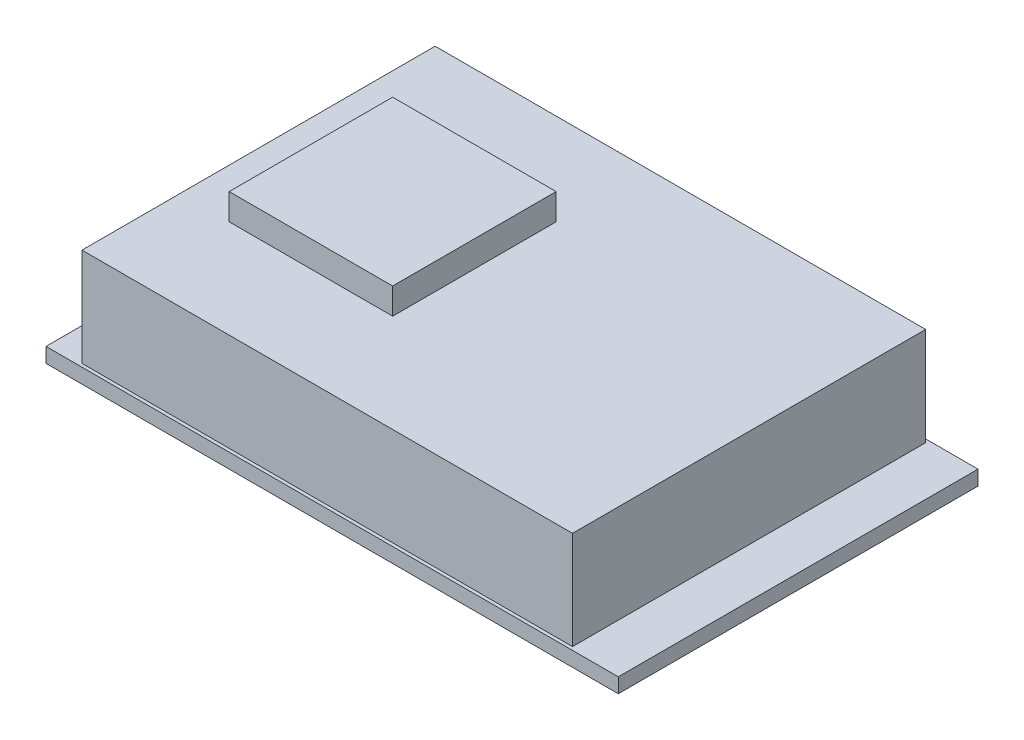
ISO-10303-21;
HEADER;
FILE_DESCRIPTION(('STEP AP214'),'2;1');
FILE_NAME('part.step','',(''),(''),'','','');
FILE_SCHEMA(('AUTOMOTIVE_DESIGN { 1 0 10303 214 1 1 1 1 }'));
ENDSEC;
DATA;
#1=APPLICATION_CONTEXT('core data for automotive mechanical design processes');
#2=APPLICATION_PROTOCOL_DEFINITION('international standard','automotive_design',2000,#1);
#3=PRODUCT_CONTEXT('',#1,'mechanical');
#4=PRODUCT('Part','Part','',(#3));
#5=PRODUCT_RELATED_PRODUCT_CATEGORY('part','',(#4));
#6=PRODUCT_DEFINITION_FORMATION('','',#4);
#7=PRODUCT_DEFINITION_CONTEXT('part definition',#1,'design');
#8=PRODUCT_DEFINITION('design','',#6,#7);
#9=PRODUCT_DEFINITION_SHAPE('','',#8);
#10=(LENGTH_UNIT() NAMED_UNIT(*) SI_UNIT(.MILLI.,.METRE.));
#11=(NAMED_UNIT(*) PLANE_ANGLE_UNIT() SI_UNIT($,.RADIAN.));
#12=(NAMED_UNIT(*) SI_UNIT($,.STERADIAN.) SOLID_ANGLE_UNIT());
#13=UNCERTAINTY_MEASURE_WITH_UNIT(LENGTH_MEASURE(1.E-05),#10,'distance_accuracy_value','');
#14=(GEOMETRIC_REPRESENTATION_CONTEXT(3) GLOBAL_UNCERTAINTY_ASSIGNED_CONTEXT((#13)) GLOBAL_UNIT_ASSIGNED_CONTEXT((#10,
#11,#12)) REPRESENTATION_CONTEXT('',''));
#15=CARTESIAN_POINT('',(0.,0.,0.));
#16=DIRECTION('',(0.,0.,1.));
#17=DIRECTION('',(1.,0.,0.));
#18=AXIS2_PLACEMENT_3D('',#15,#16,#17);
#19=CARTESIAN_POINT('',(0.,34.5,0.));
#20=DIRECTION('',(0.,-1.,0.));
#21=DIRECTION('',(0.,0.,-1.));
#22=AXIS2_PLACEMENT_3D('',#19,#20,#21);
#23=PLANE('',#22);
#24=DIRECTION('',(0.,0.,-1.));
#25=VECTOR('',#24,1.);
#26=CARTESIAN_POINT('',(72.5,34.5,-54.));
#27=LINE('',#26,#25);
#28=CARTESIAN_POINT('',(72.5,34.5,54.));
#29=VERTEX_POINT('',#28);
#30=CARTESIAN_POINT('',(72.5,34.5,-54.));
#31=VERTEX_POINT('',#30);
#32=EDGE_CURVE('E159',#29,#31,#27,.T.);
#33=ORIENTED_EDGE('',*,*,#32,.T.);
#34=DIRECTION('',(-1.,0.,0.));
#35=VECTOR('',#34,1.);
#36=CARTESIAN_POINT('',(72.5,34.5,-54.));
#37=LINE('',#36,#35);
#38=CARTESIAN_POINT('',(-77.5,34.5,-54.));
#39=VERTEX_POINT('',#38);
#40=EDGE_CURVE('E162',#31,#39,#37,.T.);
#41=ORIENTED_EDGE('',*,*,#40,.T.);
#42=DIRECTION('',(0.,0.,1.));
#43=VECTOR('',#42,1.);
#44=CARTESIAN_POINT('',(-77.5,34.5,-54.));
#45=LINE('',#44,#43);
#46=CARTESIAN_POINT('',(-77.5,34.5,54.));
#47=VERTEX_POINT('',#46);
#48=EDGE_CURVE('E165',#39,#47,#45,.T.);
#49=ORIENTED_EDGE('',*,*,#48,.T.);
#50=DIRECTION('',(1.,0.,0.));
#51=VECTOR('',#50,1.);
#52=CARTESIAN_POINT('',(72.5,34.5,54.));
#53=LINE('',#52,#51);
#54=EDGE_CURVE('E167',#47,#29,#53,.T.);
#55=ORIENTED_EDGE('',*,*,#54,.T.);
#56=EDGE_LOOP('',(#33,#41,#49,#55));
#57=FACE_BOUND('',#56,.T.);
#58=DIRECTION('',(0.,0.,1.));
#59=VECTOR('',#58,1.);
#60=CARTESIAN_POINT('',(-62.5,34.5,-26.));
#61=LINE('',#60,#59);
#62=CARTESIAN_POINT('',(-62.5,34.5,-26.));
#63=VERTEX_POINT('',#62);
#64=CARTESIAN_POINT('',(-62.5,34.5,24.));
#65=VERTEX_POINT('',#64);
#66=EDGE_CURVE('E148',#63,#65,#61,.T.);
#67=ORIENTED_EDGE('',*,*,#66,.F.);
#68=DIRECTION('',(1.,0.,0.));
#69=VECTOR('',#68,1.);
#70=CARTESIAN_POINT('',(-62.5,34.5,-26.));
#71=LINE('',#70,#69);
#72=CARTESIAN_POINT('',(-12.5,34.5,-26.));
#73=VERTEX_POINT('',#72);
#74=EDGE_CURVE('E144',#63,#73,#71,.T.);
#75=ORIENTED_EDGE('',*,*,#74,.T.);
#76=DIRECTION('',(0.,0.,1.));
#77=VECTOR('',#76,1.);
#78=CARTESIAN_POINT('',(-12.5,34.5,-26.));
#79=LINE('',#78,#77);
#80=CARTESIAN_POINT('',(-12.5,34.5,24.));
#81=VERTEX_POINT('',#80);
#82=EDGE_CURVE('E50',#73,#81,#79,.T.);
#83=ORIENTED_EDGE('',*,*,#82,.T.);
#84=DIRECTION('',(1.,0.,0.));
#85=VECTOR('',#84,1.);
#86=CARTESIAN_POINT('',(-62.5,34.5,24.));
#87=LINE('',#86,#85);
#88=EDGE_CURVE('E370',#65,#81,#87,.T.);
#89=ORIENTED_EDGE('',*,*,#88,.F.);
#90=EDGE_LOOP('',(#67,#75,#83,#89));
#91=FACE_BOUND('',#90,.T.);
#92=ADVANCED_FACE('F35',(#57,#91),#23,.F.);
#93=CARTESIAN_POINT('',(0.,4.5,0.));
#94=DIRECTION('',(0.,1.,0.));
#95=DIRECTION('',(0.,0.,1.));
#96=AXIS2_PLACEMENT_3D('',#93,#94,#95);
#97=PLANE('',#96);
#98=DIRECTION('',(0.,0.,-1.));
#99=VECTOR('',#98,1.);
#100=CARTESIAN_POINT('',(87.5,4.5,-55.));
#101=LINE('',#100,#99);
#102=CARTESIAN_POINT('',(87.5,4.5,55.));
#103=VERTEX_POINT('',#102);
#104=CARTESIAN_POINT('',(87.5,4.5,-55.));
#105=VERTEX_POINT('',#104);
#106=EDGE_CURVE('E183',#103,#105,#101,.T.);
#107=ORIENTED_EDGE('',*,*,#106,.T.);
#108=DIRECTION('',(-1.,0.,0.));
#109=VECTOR('',#108,1.);
#110=CARTESIAN_POINT('',(-87.5,4.5,-55.));
#111=LINE('',#110,#109);
#112=CARTESIAN_POINT('',(-87.5,4.5,-55.));
#113=VERTEX_POINT('',#112);
#114=EDGE_CURVE('E186',#105,#113,#111,.T.);
#115=ORIENTED_EDGE('',*,*,#114,.T.);
#116=DIRECTION('',(0.,0.,1.));
#117=VECTOR('',#116,1.);
#118=CARTESIAN_POINT('',(-87.5,4.5,-55.));
#119=LINE('',#118,#117);
#120=CARTESIAN_POINT('',(-87.5,4.5,55.));
#121=VERTEX_POINT('',#120);
#122=EDGE_CURVE('E189',#113,#121,#119,.T.);
#123=ORIENTED_EDGE('',*,*,#122,.T.);
#124=DIRECTION('',(1.,0.,0.));
#125=VECTOR('',#124,1.);
#126=CARTESIAN_POINT('',(-87.5,4.5,55.));
#127=LINE('',#126,#125);
#128=EDGE_CURVE('E191',#121,#103,#127,.T.);
#129=ORIENTED_EDGE('',*,*,#128,.T.);
#130=EDGE_LOOP('',(#107,#115,#123,#129));
#131=FACE_BOUND('',#130,.T.);
#132=DIRECTION('',(-1.,0.,0.));
#133=VECTOR('',#132,1.);
#134=CARTESIAN_POINT('',(72.5,4.5,-54.));
#135=LINE('',#134,#133);
#136=CARTESIAN_POINT('',(72.5,4.5,-54.));
#137=VERTEX_POINT('',#136);
#138=CARTESIAN_POINT('',(-77.5,4.5,-54.));
#139=VERTEX_POINT('',#138);
#140=EDGE_CURVE('E153',#137,#139,#135,.T.);
#141=ORIENTED_EDGE('',*,*,#140,.F.);
#142=DIRECTION('',(0.,0.,-1.));
#143=VECTOR('',#142,1.);
#144=CARTESIAN_POINT('',(72.5,4.5,-54.));
#145=LINE('',#144,#143);
#146=CARTESIAN_POINT('',(72.5,4.5,54.));
#147=VERTEX_POINT('',#146);
#148=EDGE_CURVE('E150',#147,#137,#145,.T.);
#149=ORIENTED_EDGE('',*,*,#148,.F.);
#150=DIRECTION('',(1.,0.,0.));
#151=VECTOR('',#150,1.);
#152=CARTESIAN_POINT('',(72.5,4.5,54.));
#153=LINE('',#152,#151);
#154=CARTESIAN_POINT('',(-77.5,4.5,54.));
#155=VERTEX_POINT('',#154);
#156=EDGE_CURVE('E163',#155,#147,#153,.T.);
#157=ORIENTED_EDGE('',*,*,#156,.F.);
#158=DIRECTION('',(0.,0.,1.));
#159=VECTOR('',#158,1.);
#160=CARTESIAN_POINT('',(-77.5,4.5,-54.));
#161=LINE('',#160,#159);
#162=EDGE_CURVE('E171',#139,#155,#161,.T.);
#163=ORIENTED_EDGE('',*,*,#162,.F.);
#164=EDGE_LOOP('',(#141,#149,#157,#163));
#165=FACE_BOUND('',#164,.T.);
#166=ADVANCED_FACE('F225',(#131,#165),#97,.T.);
#167=CARTESIAN_POINT('',(87.5,4.5,-55.));
#168=DIRECTION('',(-1.,0.,0.));
#169=DIRECTION('',(0.,0.,1.));
#170=AXIS2_PLACEMENT_3D('',#167,#168,#169);
#171=PLANE('',#170);
#172=DIRECTION('',(0.,0.,-1.));
#173=VECTOR('',#172,1.);
#174=CARTESIAN_POINT('',(87.5,0.,-55.));
#175=LINE('',#174,#173);
#176=CARTESIAN_POINT('',(87.5,0.,55.));
#177=VERTEX_POINT('',#176);
#178=CARTESIAN_POINT('',(87.5,0.,-55.));
#179=VERTEX_POINT('',#178);
#180=EDGE_CURVE('E182',#177,#179,#175,.T.);
#181=ORIENTED_EDGE('',*,*,#180,.T.);
#182=DIRECTION('',(0.,-1.,0.));
#183=VECTOR('',#182,1.);
#184=CARTESIAN_POINT('',(87.5,4.5,-55.));
#185=LINE('',#184,#183);
#186=EDGE_CURVE('E11',#105,#179,#185,.T.);
#187=ORIENTED_EDGE('',*,*,#186,.F.);
#188=ORIENTED_EDGE('',*,*,#106,.F.);
#189=DIRECTION('',(0.,-1.,0.));
#190=VECTOR('',#189,1.);
#191=CARTESIAN_POINT('',(87.5,4.5,55.));
#192=LINE('',#191,#190);
#193=EDGE_CURVE('E193',#103,#177,#192,.T.);
#194=ORIENTED_EDGE('',*,*,#193,.T.);
#195=EDGE_LOOP('',(#181,#187,#188,#194));
#196=FACE_BOUND('',#195,.T.);
#197=ADVANCED_FACE('F37',(#196),#171,.F.);
#198=CARTESIAN_POINT('',(-87.5,4.5,-55.));
#199=DIRECTION('',(0.,0.,1.));
#200=DIRECTION('',(1.,0.,0.));
#201=AXIS2_PLACEMENT_3D('',#198,#199,#200);
#202=PLANE('',#201);
#203=DIRECTION('',(-1.,0.,0.));
#204=VECTOR('',#203,1.);
#205=CARTESIAN_POINT('',(-87.5,0.,-55.));
#206=LINE('',#205,#204);
#207=CARTESIAN_POINT('',(-87.5,0.,-55.));
#208=VERTEX_POINT('',#207);
#209=EDGE_CURVE('E196',#179,#208,#206,.T.);
#210=ORIENTED_EDGE('',*,*,#209,.T.);
#211=DIRECTION('',(0.,-1.,0.));
#212=VECTOR('',#211,1.);
#213=CARTESIAN_POINT('',(-87.5,4.5,-55.));
#214=LINE('',#213,#212);
#215=EDGE_CURVE('E43',#113,#208,#214,.T.);
#216=ORIENTED_EDGE('',*,*,#215,.F.);
#217=ORIENTED_EDGE('',*,*,#114,.F.);
#218=ORIENTED_EDGE('',*,*,#186,.T.);
#219=EDGE_LOOP('',(#210,#216,#217,#218));
#220=FACE_BOUND('',#219,.T.);
#221=ADVANCED_FACE('F227',(#220),#202,.F.);
#222=CARTESIAN_POINT('',(-87.5,4.5,-55.));
#223=DIRECTION('',(1.,0.,0.));
#224=DIRECTION('',(0.,0.,-1.));
#225=AXIS2_PLACEMENT_3D('',#222,#223,#224);
#226=PLANE('',#225);
#227=DIRECTION('',(0.,0.,1.));
#228=VECTOR('',#227,1.);
#229=CARTESIAN_POINT('',(-87.5,0.,-55.));
#230=LINE('',#229,#228);
#231=CARTESIAN_POINT('',(-87.5,0.,55.));
#232=VERTEX_POINT('',#231);
#233=EDGE_CURVE('E198',#208,#232,#230,.T.);
#234=ORIENTED_EDGE('',*,*,#233,.T.);
#235=DIRECTION('',(0.,-1.,0.));
#236=VECTOR('',#235,1.);
#237=CARTESIAN_POINT('',(-87.5,4.5,55.));
#238=LINE('',#237,#236);
#239=EDGE_CURVE('E203',#121,#232,#238,.T.);
#240=ORIENTED_EDGE('',*,*,#239,.F.);
#241=ORIENTED_EDGE('',*,*,#122,.F.);
#242=ORIENTED_EDGE('',*,*,#215,.T.);
#243=EDGE_LOOP('',(#234,#240,#241,#242));
#244=FACE_BOUND('',#243,.T.);
#245=ADVANCED_FACE('F210',(#244),#226,.F.);
#246=CARTESIAN_POINT('',(-87.5,4.5,55.));
#247=DIRECTION('',(0.,0.,-1.));
#248=DIRECTION('',(-1.,0.,0.));
#249=AXIS2_PLACEMENT_3D('',#246,#247,#248);
#250=PLANE('',#249);
#251=DIRECTION('',(1.,0.,0.));
#252=VECTOR('',#251,1.);
#253=CARTESIAN_POINT('',(-87.5,0.,55.));
#254=LINE('',#253,#252);
#255=EDGE_CURVE('E187',#232,#177,#254,.T.);
#256=ORIENTED_EDGE('',*,*,#255,.T.);
#257=ORIENTED_EDGE('',*,*,#193,.F.);
#258=ORIENTED_EDGE('',*,*,#128,.F.);
#259=ORIENTED_EDGE('',*,*,#239,.T.);
#260=EDGE_LOOP('',(#256,#257,#258,#259));
#261=FACE_BOUND('',#260,.T.);
#262=ADVANCED_FACE('F219',(#261),#250,.F.);
#263=CARTESIAN_POINT('',(0.,0.,0.));
#264=DIRECTION('',(0.,1.,0.));
#265=DIRECTION('',(0.,0.,1.));
#266=AXIS2_PLACEMENT_3D('',#263,#264,#265);
#267=PLANE('',#266);
#268=ORIENTED_EDGE('',*,*,#180,.F.);
#269=ORIENTED_EDGE('',*,*,#255,.F.);
#270=ORIENTED_EDGE('',*,*,#233,.F.);
#271=ORIENTED_EDGE('',*,*,#209,.F.);
#272=EDGE_LOOP('',(#268,#269,#270,#271));
#273=FACE_BOUND('',#272,.T.);
#274=ADVANCED_FACE('F216',(#273),#267,.F.);
#275=CARTESIAN_POINT('',(72.5,34.5,-54.));
#276=DIRECTION('',(-1.,0.,0.));
#277=DIRECTION('',(0.,0.,1.));
#278=AXIS2_PLACEMENT_3D('',#275,#276,#277);
#279=PLANE('',#278);
#280=ORIENTED_EDGE('',*,*,#148,.T.);
#281=DIRECTION('',(0.,-1.,0.));
#282=VECTOR('',#281,1.);
#283=CARTESIAN_POINT('',(72.5,34.5,-54.));
#284=LINE('',#283,#282);
#285=EDGE_CURVE('E180',#31,#137,#284,.T.);
#286=ORIENTED_EDGE('',*,*,#285,.F.);
#287=ORIENTED_EDGE('',*,*,#32,.F.);
#288=DIRECTION('',(0.,-1.,0.));
#289=VECTOR('',#288,1.);
#290=CARTESIAN_POINT('',(72.5,34.5,54.));
#291=LINE('',#290,#289);
#292=EDGE_CURVE('E168',#29,#147,#291,.T.);
#293=ORIENTED_EDGE('',*,*,#292,.T.);
#294=EDGE_LOOP('',(#280,#286,#287,#293));
#295=FACE_BOUND('',#294,.T.);
#296=ADVANCED_FACE('F255',(#295),#279,.F.);
#297=CARTESIAN_POINT('',(72.5,34.5,-54.));
#298=DIRECTION('',(0.,0.,1.));
#299=DIRECTION('',(1.,0.,0.));
#300=AXIS2_PLACEMENT_3D('',#297,#298,#299);
#301=PLANE('',#300);
#302=ORIENTED_EDGE('',*,*,#140,.T.);
#303=DIRECTION('',(0.,-1.,0.));
#304=VECTOR('',#303,1.);
#305=CARTESIAN_POINT('',(-77.5,34.5,-54.));
#306=LINE('',#305,#304);
#307=EDGE_CURVE('E177',#39,#139,#306,.T.);
#308=ORIENTED_EDGE('',*,*,#307,.F.);
#309=ORIENTED_EDGE('',*,*,#40,.F.);
#310=ORIENTED_EDGE('',*,*,#285,.T.);
#311=EDGE_LOOP('',(#302,#308,#309,#310));
#312=FACE_BOUND('',#311,.T.);
#313=ADVANCED_FACE('F251',(#312),#301,.F.);
#314=CARTESIAN_POINT('',(-77.5,34.5,-54.));
#315=DIRECTION('',(1.,0.,0.));
#316=DIRECTION('',(0.,0.,-1.));
#317=AXIS2_PLACEMENT_3D('',#314,#315,#316);
#318=PLANE('',#317);
#319=ORIENTED_EDGE('',*,*,#162,.T.);
#320=DIRECTION('',(0.,-1.,0.));
#321=VECTOR('',#320,1.);
#322=CARTESIAN_POINT('',(-77.5,34.5,54.));
#323=LINE('',#322,#321);
#324=EDGE_CURVE('E58',#47,#155,#323,.T.);
#325=ORIENTED_EDGE('',*,*,#324,.F.);
#326=ORIENTED_EDGE('',*,*,#48,.F.);
#327=ORIENTED_EDGE('',*,*,#307,.T.);
#328=EDGE_LOOP('',(#319,#325,#326,#327));
#329=FACE_BOUND('',#328,.T.);
#330=ADVANCED_FACE('F248',(#329),#318,.F.);
#331=CARTESIAN_POINT('',(72.5,34.5,54.));
#332=DIRECTION('',(0.,0.,-1.));
#333=DIRECTION('',(-1.,0.,0.));
#334=AXIS2_PLACEMENT_3D('',#331,#332,#333);
#335=PLANE('',#334);
#336=ORIENTED_EDGE('',*,*,#156,.T.);
#337=ORIENTED_EDGE('',*,*,#292,.F.);
#338=ORIENTED_EDGE('',*,*,#54,.F.);
#339=ORIENTED_EDGE('',*,*,#324,.T.);
#340=EDGE_LOOP('',(#336,#337,#338,#339));
#341=FACE_BOUND('',#340,.T.);
#342=ADVANCED_FACE('F245',(#341),#335,.F.);
#343=CARTESIAN_POINT('',(-62.5,42.5,-26.));
#344=DIRECTION('',(1.,0.,0.));
#345=DIRECTION('',(0.,0.,-1.));
#346=AXIS2_PLACEMENT_3D('',#343,#344,#345);
#347=PLANE('',#346);
#348=ORIENTED_EDGE('',*,*,#66,.T.);
#349=DIRECTION('',(0.,-1.,0.));
#350=VECTOR('',#349,1.);
#351=CARTESIAN_POINT('',(-62.5,42.5,24.));
#352=LINE('',#351,#350);
#353=CARTESIAN_POINT('',(-62.5,42.5,24.));
#354=VERTEX_POINT('',#353);
#355=EDGE_CURVE('E129',#354,#65,#352,.T.);
#356=ORIENTED_EDGE('',*,*,#355,.F.);
#357=DIRECTION('',(0.,0.,1.));
#358=VECTOR('',#357,1.);
#359=CARTESIAN_POINT('',(-62.5,42.5,-26.));
#360=LINE('',#359,#358);
#361=CARTESIAN_POINT('',(-62.5,42.5,-26.));
#362=VERTEX_POINT('',#361);
#363=EDGE_CURVE('E136',#362,#354,#360,.T.);
#364=ORIENTED_EDGE('',*,*,#363,.F.);
#365=DIRECTION('',(0.,-1.,0.));
#366=VECTOR('',#365,1.);
#367=CARTESIAN_POINT('',(-62.5,42.5,-26.));
#368=LINE('',#367,#366);
#369=EDGE_CURVE('E368',#362,#63,#368,.T.);
#370=ORIENTED_EDGE('',*,*,#369,.T.);
#371=EDGE_LOOP('',(#348,#356,#364,#370));
#372=FACE_BOUND('',#371,.T.);
#373=ADVANCED_FACE('F146',(#372),#347,.F.);
#374=CARTESIAN_POINT('',(-62.5,42.5,24.));
#375=DIRECTION('',(0.,0.,-1.));
#376=DIRECTION('',(-1.,0.,0.));
#377=AXIS2_PLACEMENT_3D('',#374,#375,#376);
#378=PLANE('',#377);
#379=ORIENTED_EDGE('',*,*,#88,.T.);
#380=DIRECTION('',(0.,-1.,0.));
#381=VECTOR('',#380,1.);
#382=CARTESIAN_POINT('',(-12.5,42.5,24.));
#383=LINE('',#382,#381);
#384=CARTESIAN_POINT('',(-12.5,42.5,24.));
#385=VERTEX_POINT('',#384);
#386=EDGE_CURVE('E131',#385,#81,#383,.T.);
#387=ORIENTED_EDGE('',*,*,#386,.F.);
#388=DIRECTION('',(1.,0.,0.));
#389=VECTOR('',#388,1.);
#390=CARTESIAN_POINT('',(-62.5,42.5,24.));
#391=LINE('',#390,#389);
#392=EDGE_CURVE('E124',#354,#385,#391,.T.);
#393=ORIENTED_EDGE('',*,*,#392,.F.);
#394=ORIENTED_EDGE('',*,*,#355,.T.);
#395=EDGE_LOOP('',(#379,#387,#393,#394));
#396=FACE_BOUND('',#395,.T.);
#397=ADVANCED_FACE('F127',(#396),#378,.F.);
#398=CARTESIAN_POINT('',(-12.5,42.5,-26.));
#399=DIRECTION('',(1.,0.,0.));
#400=DIRECTION('',(0.,0.,-1.));
#401=AXIS2_PLACEMENT_3D('',#398,#399,#400);
#402=PLANE('',#401);
#403=ORIENTED_EDGE('',*,*,#82,.F.);
#404=DIRECTION('',(0.,-1.,0.));
#405=VECTOR('',#404,1.);
#406=CARTESIAN_POINT('',(-12.5,42.5,-26.));
#407=LINE('',#406,#405);
#408=CARTESIAN_POINT('',(-12.5,42.5,-26.));
#409=VERTEX_POINT('',#408);
#410=EDGE_CURVE('E155',#409,#73,#407,.T.);
#411=ORIENTED_EDGE('',*,*,#410,.F.);
#412=DIRECTION('',(0.,0.,1.));
#413=VECTOR('',#412,1.);
#414=CARTESIAN_POINT('',(-12.5,42.5,-26.));
#415=LINE('',#414,#413);
#416=EDGE_CURVE('E135',#409,#385,#415,.T.);
#417=ORIENTED_EDGE('',*,*,#416,.T.);
#418=ORIENTED_EDGE('',*,*,#386,.T.);
#419=EDGE_LOOP('',(#403,#411,#417,#418));
#420=FACE_BOUND('',#419,.T.);
#421=ADVANCED_FACE('F299',(#420),#402,.T.);
#422=CARTESIAN_POINT('',(-62.5,42.5,-26.));
#423=DIRECTION('',(0.,0.,-1.));
#424=DIRECTION('',(-1.,0.,0.));
#425=AXIS2_PLACEMENT_3D('',#422,#423,#424);
#426=PLANE('',#425);
#427=ORIENTED_EDGE('',*,*,#74,.F.);
#428=ORIENTED_EDGE('',*,*,#369,.F.);
#429=DIRECTION('',(1.,0.,0.));
#430=VECTOR('',#429,1.);
#431=CARTESIAN_POINT('',(-62.5,42.5,-26.));
#432=LINE('',#431,#430);
#433=EDGE_CURVE('E142',#362,#409,#432,.T.);
#434=ORIENTED_EDGE('',*,*,#433,.T.);
#435=ORIENTED_EDGE('',*,*,#410,.T.);
#436=EDGE_LOOP('',(#427,#428,#434,#435));
#437=FACE_BOUND('',#436,.T.);
#438=ADVANCED_FACE('F305',(#437),#426,.T.);
#439=CARTESIAN_POINT('',(0.,42.5,0.));
#440=DIRECTION('',(0.,1.,0.));
#441=DIRECTION('',(0.,0.,1.));
#442=AXIS2_PLACEMENT_3D('',#439,#440,#441);
#443=PLANE('',#442);
#444=ORIENTED_EDGE('',*,*,#363,.T.);
#445=ORIENTED_EDGE('',*,*,#392,.T.);
#446=ORIENTED_EDGE('',*,*,#416,.F.);
#447=ORIENTED_EDGE('',*,*,#433,.F.);
#448=EDGE_LOOP('',(#444,#445,#446,#447));
#449=FACE_BOUND('',#448,.T.);
#450=ADVANCED_FACE('F140',(#449),#443,.T.);
#451=CLOSED_SHELL('',(#92,#166,#197,#221,#245,#262,#274,#296,#313,#330,#342,#373,#397,#421,#438,#450));
#452=MANIFOLD_SOLID_BREP('B2',#451);
#453=ADVANCED_BREP_SHAPE_REPRESENTATION('',(#18,#452),#14);
#454=SHAPE_DEFINITION_REPRESENTATION(#9,#453);
ENDSEC;
END-ISO-10303-21;
